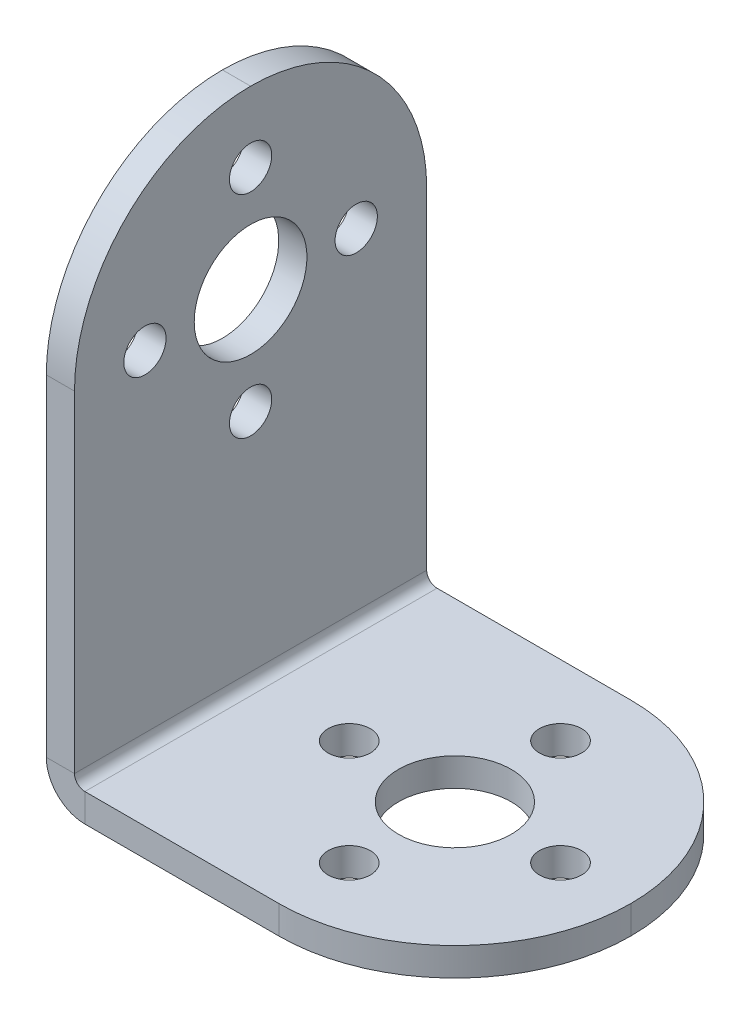
ISO-10303-21;
HEADER;
FILE_DESCRIPTION(('STEP AP214'),'2;1');
FILE_NAME('part.step','',(''),(''),'','','');
FILE_SCHEMA(('AUTOMOTIVE_DESIGN { 1 0 10303 214 1 1 1 1 }'));
ENDSEC;
DATA;
#1=APPLICATION_CONTEXT('core data for automotive mechanical design processes');
#2=APPLICATION_PROTOCOL_DEFINITION('international standard','automotive_design',2000,#1);
#3=PRODUCT_CONTEXT('',#1,'mechanical');
#4=PRODUCT('Part','Part','',(#3));
#5=PRODUCT_RELATED_PRODUCT_CATEGORY('part','',(#4));
#6=PRODUCT_DEFINITION_FORMATION('','',#4);
#7=PRODUCT_DEFINITION_CONTEXT('part definition',#1,'design');
#8=PRODUCT_DEFINITION('design','',#6,#7);
#9=PRODUCT_DEFINITION_SHAPE('','',#8);
#10=(LENGTH_UNIT() NAMED_UNIT(*) SI_UNIT(.MILLI.,.METRE.));
#11=(NAMED_UNIT(*) PLANE_ANGLE_UNIT() SI_UNIT($,.RADIAN.));
#12=(NAMED_UNIT(*) SI_UNIT($,.STERADIAN.) SOLID_ANGLE_UNIT());
#13=UNCERTAINTY_MEASURE_WITH_UNIT(LENGTH_MEASURE(1.E-05),#10,'distance_accuracy_value','');
#14=(GEOMETRIC_REPRESENTATION_CONTEXT(3) GLOBAL_UNCERTAINTY_ASSIGNED_CONTEXT((#13)) GLOBAL_UNIT_ASSIGNED_CONTEXT((#10,
#11,#12)) REPRESENTATION_CONTEXT('',''));
#15=CARTESIAN_POINT('',(0.,0.,0.));
#16=DIRECTION('',(0.,0.,1.));
#17=DIRECTION('',(1.,0.,0.));
#18=AXIS2_PLACEMENT_3D('',#15,#16,#17);
#19=CARTESIAN_POINT('',(3.50000000000008,24.246355098888,12.5));
#20=DIRECTION('',(0.,0.,1.));
#21=DIRECTION('',(0.,-1.,0.));
#22=AXIS2_PLACEMENT_3D('',#19,#20,#21);
#23=PLANE('',#22);
#24=DIRECTION('',(0.,-1.,0.));
#25=VECTOR('',#24,1.);
#26=CARTESIAN_POINT('',(3.50000000000008,24.246355098888,12.5));
#27=LINE('',#26,#25);
#28=CARTESIAN_POINT('',(3.50000000000008,24.246355098888,12.5));
#29=VERTEX_POINT('',#28);
#30=CARTESIAN_POINT('',(3.5,0.736600000000013,12.5));
#31=VERTEX_POINT('',#30);
#32=EDGE_CURVE('E288',#29,#31,#27,.T.);
#33=ORIENTED_EDGE('',*,*,#32,.T.);
#34=DIRECTION('',(1.,0.,0.));
#35=VECTOR('',#34,1.);
#36=CARTESIAN_POINT('',(3.5,0.736600000000013,12.5));
#37=LINE('',#36,#35);
#38=CARTESIAN_POINT('',(5.5,0.736600000000006,12.5));
#39=VERTEX_POINT('',#38);
#40=EDGE_CURVE('E12',#31,#39,#37,.T.);
#41=ORIENTED_EDGE('',*,*,#40,.T.);
#42=DIRECTION('',(0.,-1.,0.));
#43=VECTOR('',#42,1.);
#44=CARTESIAN_POINT('',(5.50000000000008,24.246355098888,12.5));
#45=LINE('',#44,#43);
#46=CARTESIAN_POINT('',(5.50000000000008,24.246355098888,12.5));
#47=VERTEX_POINT('',#46);
#48=EDGE_CURVE('E62',#47,#39,#45,.T.);
#49=ORIENTED_EDGE('',*,*,#48,.F.);
#50=DIRECTION('',(1.,0.,0.));
#51=VECTOR('',#50,1.);
#52=CARTESIAN_POINT('',(3.50000000000008,24.246355098888,12.5));
#53=LINE('',#52,#51);
#54=EDGE_CURVE('E162',#29,#47,#53,.T.);
#55=ORIENTED_EDGE('',*,*,#54,.F.);
#56=EDGE_LOOP('',(#33,#41,#49,#55));
#57=FACE_BOUND('',#56,.T.);
#58=ADVANCED_FACE('F46',(#57),#23,.T.);
#59=CARTESIAN_POINT('',(3.50000000000008,24.246355098888,-12.5));
#60=DIRECTION('',(0.,0.,-1.));
#61=DIRECTION('',(0.,1.,0.));
#62=AXIS2_PLACEMENT_3D('',#59,#60,#61);
#63=PLANE('',#62);
#64=DIRECTION('',(0.,1.,0.));
#65=VECTOR('',#64,1.);
#66=CARTESIAN_POINT('',(5.50000000000008,24.246355098888,-12.5));
#67=LINE('',#66,#65);
#68=CARTESIAN_POINT('',(5.49999999999999,0.736600000000006,-12.5));
#69=VERTEX_POINT('',#68);
#70=CARTESIAN_POINT('',(5.50000000000008,24.246355098888,-12.5));
#71=VERTEX_POINT('',#70);
#72=EDGE_CURVE('E69',#69,#71,#67,.T.);
#73=ORIENTED_EDGE('',*,*,#72,.F.);
#74=DIRECTION('',(-1.,0.,0.));
#75=VECTOR('',#74,1.);
#76=CARTESIAN_POINT('',(3.49999999999999,0.736600000000013,-12.5));
#77=LINE('',#76,#75);
#78=CARTESIAN_POINT('',(3.49999999999999,0.736600000000007,-12.5));
#79=VERTEX_POINT('',#78);
#80=EDGE_CURVE('E134',#69,#79,#77,.T.);
#81=ORIENTED_EDGE('',*,*,#80,.T.);
#82=DIRECTION('',(0.,1.,0.));
#83=VECTOR('',#82,1.);
#84=CARTESIAN_POINT('',(3.50000000000008,24.246355098888,-12.5));
#85=LINE('',#84,#83);
#86=CARTESIAN_POINT('',(3.50000000000008,24.246355098888,-12.5));
#87=VERTEX_POINT('',#86);
#88=EDGE_CURVE('E49',#79,#87,#85,.T.);
#89=ORIENTED_EDGE('',*,*,#88,.T.);
#90=DIRECTION('',(1.,0.,0.));
#91=VECTOR('',#90,1.);
#92=CARTESIAN_POINT('',(3.50000000000008,24.246355098888,-12.5));
#93=LINE('',#92,#91);
#94=EDGE_CURVE('E302',#87,#71,#93,.T.);
#95=ORIENTED_EDGE('',*,*,#94,.T.);
#96=EDGE_LOOP('',(#73,#81,#89,#95));
#97=FACE_BOUND('',#96,.T.);
#98=ADVANCED_FACE('F136',(#97),#63,.T.);
#99=CARTESIAN_POINT('',(5.49999999999994,-15.755644901112,0.00100000000000378));
#100=DIRECTION('',(1.,0.,0.));
#101=DIRECTION('',(0.,0.,1.));
#102=AXIS2_PLACEMENT_3D('',#99,#100,#101);
#103=PLANE('',#102);
#104=CARTESIAN_POINT('',(5.50000000000008,24.246355098888,0.000999999999998224));
#105=DIRECTION('',(1.,0.,0.));
#106=DIRECTION('',(0.,0.,1.));
#107=AXIS2_PLACEMENT_3D('',#104,#105,#106);
#108=CIRCLE('',#107,4.);
#109=CARTESIAN_POINT('',(5.50000000000008,24.246355098888,4.001));
#110=VERTEX_POINT('',#109);
#111=EDGE_CURVE('E273',#110,#110,#108,.T.);
#112=ORIENTED_EDGE('',*,*,#111,.F.);
#113=EDGE_LOOP('',(#112));
#114=FACE_BOUND('',#113,.T.);
#115=CARTESIAN_POINT('',(5.50000000000008,24.246355098836,-7.499));
#116=DIRECTION('',(1.,0.,0.));
#117=DIRECTION('',(0.,0.,1.));
#118=AXIS2_PLACEMENT_3D('',#115,#116,#117);
#119=CIRCLE('',#118,1.5);
#120=CARTESIAN_POINT('',(5.50000000000008,24.246355098836,-5.999));
#121=VERTEX_POINT('',#120);
#122=EDGE_CURVE('E267',#121,#121,#119,.T.);
#123=ORIENTED_EDGE('',*,*,#122,.F.);
#124=EDGE_LOOP('',(#123));
#125=FACE_BOUND('',#124,.T.);
#126=CARTESIAN_POINT('',(5.50000000000005,16.7463551655546,0.));
#127=DIRECTION('',(1.,0.,0.));
#128=DIRECTION('',(0.,0.,1.));
#129=AXIS2_PLACEMENT_3D('',#126,#127,#128);
#130=CIRCLE('',#129,1.5);
#131=CARTESIAN_POINT('',(5.50000000000005,16.7463551655546,1.5));
#132=VERTEX_POINT('',#131);
#133=EDGE_CURVE('E261',#132,#132,#130,.T.);
#134=ORIENTED_EDGE('',*,*,#133,.F.);
#135=EDGE_LOOP('',(#134));
#136=FACE_BOUND('',#135,.T.);
#137=CARTESIAN_POINT('',(5.50000000000008,24.246355098888,7.501));
#138=DIRECTION('',(1.,0.,0.));
#139=DIRECTION('',(0.,0.,1.));
#140=AXIS2_PLACEMENT_3D('',#137,#138,#139);
#141=CIRCLE('',#140,1.5);
#142=CARTESIAN_POINT('',(5.50000000000008,24.246355098888,9.001));
#143=VERTEX_POINT('',#142);
#144=EDGE_CURVE('E255',#143,#143,#141,.T.);
#145=ORIENTED_EDGE('',*,*,#144,.F.);
#146=EDGE_LOOP('',(#145));
#147=FACE_BOUND('',#146,.T.);
#148=CARTESIAN_POINT('',(5.5000000000001,31.7463550613889,0.00025000937890369));
#149=DIRECTION('',(1.,0.,0.));
#150=DIRECTION('',(0.,0.,1.));
#151=AXIS2_PLACEMENT_3D('',#148,#149,#150);
#152=CIRCLE('',#151,1.5);
#153=CARTESIAN_POINT('',(5.5000000000001,31.7463550613889,1.5002500093789));
#154=VERTEX_POINT('',#153);
#155=EDGE_CURVE('E183',#154,#154,#152,.T.);
#156=ORIENTED_EDGE('',*,*,#155,.F.);
#157=EDGE_LOOP('',(#156));
#158=FACE_BOUND('',#157,.T.);
#159=ORIENTED_EDGE('',*,*,#48,.T.);
#160=DIRECTION('',(0.,0.,-1.));
#161=VECTOR('',#160,1.);
#162=CARTESIAN_POINT('',(5.5,0.736600000000004,0.00100000000000378));
#163=LINE('',#162,#161);
#164=EDGE_CURVE('E54',#39,#69,#163,.T.);
#165=ORIENTED_EDGE('',*,*,#164,.T.);
#166=ORIENTED_EDGE('',*,*,#72,.T.);
#167=CARTESIAN_POINT('',(5.50000000000008,24.246355098888,-0.00100000000000378));
#168=DIRECTION('',(1.,0.,0.));
#169=DIRECTION('',(0.,0.,-1.));
#170=AXIS2_PLACEMENT_3D('',#167,#168,#169);
#171=CIRCLE('',#170,12.499);
#172=CARTESIAN_POINT('',(5.50000000000012,36.745355098888,-0.00100000000000551));
#173=VERTEX_POINT('',#172);
#174=EDGE_CURVE('E289',#71,#173,#171,.T.);
#175=ORIENTED_EDGE('',*,*,#174,.T.);
#176=DIRECTION('',(0.,0.,1.));
#177=VECTOR('',#176,1.);
#178=CARTESIAN_POINT('',(5.50000000000012,36.745355098888,0.00099999999999649));
#179=LINE('',#178,#177);
#180=CARTESIAN_POINT('',(5.50000000000012,36.745355098888,0.000999999999998786));
#181=VERTEX_POINT('',#180);
#182=EDGE_CURVE('E292',#173,#181,#179,.T.);
#183=ORIENTED_EDGE('',*,*,#182,.T.);
#184=CARTESIAN_POINT('',(5.50000000000008,24.246355098888,0.000999999999998224));
#185=DIRECTION('',(1.,0.,0.));
#186=DIRECTION('',(0.,0.,-1.));
#187=AXIS2_PLACEMENT_3D('',#184,#185,#186);
#188=CIRCLE('',#187,12.499);
#189=EDGE_CURVE('E295',#181,#47,#188,.T.);
#190=ORIENTED_EDGE('',*,*,#189,.T.);
#191=EDGE_LOOP('',(#159,#165,#166,#175,#183,#190));
#192=FACE_BOUND('',#191,.T.);
#193=ADVANCED_FACE('F306',(#114,#125,#136,#147,#158,#192),#103,.T.);
#194=CARTESIAN_POINT('',(3.50000000000008,24.246355098888,0.000999999999998502));
#195=DIRECTION('',(1.,0.,0.));
#196=DIRECTION('',(0.,0.,1.));
#197=AXIS2_PLACEMENT_3D('',#194,#195,#196);
#198=CYLINDRICAL_SURFACE('',#197,12.499);
#199=ORIENTED_EDGE('',*,*,#189,.F.);
#200=DIRECTION('',(1.,0.,0.));
#201=VECTOR('',#200,1.);
#202=CARTESIAN_POINT('',(3.50000000000012,36.745355098888,0.000999999999999063));
#203=LINE('',#202,#201);
#204=CARTESIAN_POINT('',(3.50000000000012,36.745355098888,0.000999999999999063));
#205=VERTEX_POINT('',#204);
#206=EDGE_CURVE('E298',#205,#181,#203,.T.);
#207=ORIENTED_EDGE('',*,*,#206,.F.);
#208=CARTESIAN_POINT('',(3.50000000000008,24.246355098888,0.000999999999998502));
#209=DIRECTION('',(1.,0.,0.));
#210=DIRECTION('',(0.,0.,-1.));
#211=AXIS2_PLACEMENT_3D('',#208,#209,#210);
#212=CIRCLE('',#211,12.499);
#213=EDGE_CURVE('E285',#205,#29,#212,.T.);
#214=ORIENTED_EDGE('',*,*,#213,.T.);
#215=ORIENTED_EDGE('',*,*,#54,.T.);
#216=EDGE_LOOP('',(#199,#207,#214,#215));
#217=FACE_BOUND('',#216,.T.);
#218=ADVANCED_FACE('F368',(#217),#198,.T.);
#219=CARTESIAN_POINT('',(3.50000000000012,36.745355098888,0.000999999999996767));
#220=DIRECTION('',(0.,1.,0.));
#221=DIRECTION('',(0.,0.,1.));
#222=AXIS2_PLACEMENT_3D('',#219,#220,#221);
#223=PLANE('',#222);
#224=ORIENTED_EDGE('',*,*,#182,.F.);
#225=DIRECTION('',(1.,0.,0.));
#226=VECTOR('',#225,1.);
#227=CARTESIAN_POINT('',(3.50000000000012,36.745355098888,-0.00100000000000523));
#228=LINE('',#227,#226);
#229=CARTESIAN_POINT('',(3.50000000000012,36.745355098888,-0.00100000000000523));
#230=VERTEX_POINT('',#229);
#231=EDGE_CURVE('E300',#230,#173,#228,.T.);
#232=ORIENTED_EDGE('',*,*,#231,.F.);
#233=DIRECTION('',(0.,0.,1.));
#234=VECTOR('',#233,1.);
#235=CARTESIAN_POINT('',(3.50000000000012,36.745355098888,0.000999999999996767));
#236=LINE('',#235,#234);
#237=EDGE_CURVE('E282',#230,#205,#236,.T.);
#238=ORIENTED_EDGE('',*,*,#237,.T.);
#239=ORIENTED_EDGE('',*,*,#206,.T.);
#240=EDGE_LOOP('',(#224,#232,#238,#239));
#241=FACE_BOUND('',#240,.T.);
#242=ADVANCED_FACE('F313',(#241),#223,.T.);
#243=CARTESIAN_POINT('',(3.50000000000008,24.246355098888,-0.0010000000000035));
#244=DIRECTION('',(1.,0.,0.));
#245=DIRECTION('',(0.,0.,1.));
#246=AXIS2_PLACEMENT_3D('',#243,#244,#245);
#247=CYLINDRICAL_SURFACE('',#246,12.499);
#248=ORIENTED_EDGE('',*,*,#174,.F.);
#249=ORIENTED_EDGE('',*,*,#94,.F.);
#250=CARTESIAN_POINT('',(3.50000000000008,24.246355098888,-0.0010000000000035));
#251=DIRECTION('',(1.,0.,0.));
#252=DIRECTION('',(0.,0.,-1.));
#253=AXIS2_PLACEMENT_3D('',#250,#251,#252);
#254=CIRCLE('',#253,12.499);
#255=EDGE_CURVE('E153',#87,#230,#254,.T.);
#256=ORIENTED_EDGE('',*,*,#255,.T.);
#257=ORIENTED_EDGE('',*,*,#231,.T.);
#258=EDGE_LOOP('',(#248,#249,#256,#257));
#259=FACE_BOUND('',#258,.T.);
#260=ADVANCED_FACE('F310',(#259),#247,.T.);
#261=CARTESIAN_POINT('',(3.49999999999994,-15.755644901112,0.00100000000000405));
#262=DIRECTION('',(1.,0.,0.));
#263=DIRECTION('',(0.,0.,1.));
#264=AXIS2_PLACEMENT_3D('',#261,#262,#263);
#265=PLANE('',#264);
#266=DIRECTION('',(0.,0.,-1.));
#267=VECTOR('',#266,1.);
#268=CARTESIAN_POINT('',(3.5,0.736600000000011,0.00100000000000405));
#269=LINE('',#268,#267);
#270=EDGE_CURVE('E142',#31,#79,#269,.T.);
#271=ORIENTED_EDGE('',*,*,#270,.F.);
#272=ORIENTED_EDGE('',*,*,#32,.F.);
#273=ORIENTED_EDGE('',*,*,#213,.F.);
#274=ORIENTED_EDGE('',*,*,#237,.F.);
#275=ORIENTED_EDGE('',*,*,#255,.F.);
#276=ORIENTED_EDGE('',*,*,#88,.F.);
#277=EDGE_LOOP('',(#271,#272,#273,#274,#275,#276));
#278=FACE_BOUND('',#277,.T.);
#279=CARTESIAN_POINT('',(3.5000000000001,31.7463550613889,0.000250009378903968));
#280=DIRECTION('',(1.,0.,0.));
#281=DIRECTION('',(0.,0.,1.));
#282=AXIS2_PLACEMENT_3D('',#279,#280,#281);
#283=CIRCLE('',#282,1.5);
#284=CARTESIAN_POINT('',(3.5000000000001,31.7463550613889,1.5002500093789));
#285=VERTEX_POINT('',#284);
#286=EDGE_CURVE('E252',#285,#285,#283,.T.);
#287=ORIENTED_EDGE('',*,*,#286,.T.);
#288=EDGE_LOOP('',(#287));
#289=FACE_BOUND('',#288,.T.);
#290=CARTESIAN_POINT('',(3.50000000000008,24.246355098888,7.501));
#291=DIRECTION('',(1.,0.,0.));
#292=DIRECTION('',(0.,0.,1.));
#293=AXIS2_PLACEMENT_3D('',#290,#291,#292);
#294=CIRCLE('',#293,1.5);
#295=CARTESIAN_POINT('',(3.50000000000008,24.246355098888,9.001));
#296=VERTEX_POINT('',#295);
#297=EDGE_CURVE('E258',#296,#296,#294,.T.);
#298=ORIENTED_EDGE('',*,*,#297,.T.);
#299=EDGE_LOOP('',(#298));
#300=FACE_BOUND('',#299,.T.);
#301=CARTESIAN_POINT('',(3.50000000000005,16.7463551655547,0.));
#302=DIRECTION('',(1.,0.,0.));
#303=DIRECTION('',(0.,0.,1.));
#304=AXIS2_PLACEMENT_3D('',#301,#302,#303);
#305=CIRCLE('',#304,1.5);
#306=CARTESIAN_POINT('',(3.50000000000005,16.7463551655547,1.5));
#307=VERTEX_POINT('',#306);
#308=EDGE_CURVE('E264',#307,#307,#305,.T.);
#309=ORIENTED_EDGE('',*,*,#308,.T.);
#310=EDGE_LOOP('',(#309));
#311=FACE_BOUND('',#310,.T.);
#312=CARTESIAN_POINT('',(3.50000000000008,24.246355098836,-7.499));
#313=DIRECTION('',(1.,0.,0.));
#314=DIRECTION('',(0.,0.,1.));
#315=AXIS2_PLACEMENT_3D('',#312,#313,#314);
#316=CIRCLE('',#315,1.5);
#317=CARTESIAN_POINT('',(3.50000000000008,24.246355098836,-5.999));
#318=VERTEX_POINT('',#317);
#319=EDGE_CURVE('E270',#318,#318,#316,.T.);
#320=ORIENTED_EDGE('',*,*,#319,.T.);
#321=EDGE_LOOP('',(#320));
#322=FACE_BOUND('',#321,.T.);
#323=CARTESIAN_POINT('',(3.50000000000008,24.246355098888,0.000999999999998502));
#324=DIRECTION('',(1.,0.,0.));
#325=DIRECTION('',(0.,0.,1.));
#326=AXIS2_PLACEMENT_3D('',#323,#324,#325);
#327=CIRCLE('',#326,4.);
#328=CARTESIAN_POINT('',(3.50000000000008,24.246355098888,4.001));
#329=VERTEX_POINT('',#328);
#330=EDGE_CURVE('E276',#329,#329,#327,.T.);
#331=ORIENTED_EDGE('',*,*,#330,.T.);
#332=EDGE_LOOP('',(#331));
#333=FACE_BOUND('',#332,.T.);
#334=ADVANCED_FACE('F147',(#278,#289,#300,#311,#322,#333),#265,.F.);
#335=CARTESIAN_POINT('',(3.50000000000008,24.246355098888,0.000999999999998502));
#336=DIRECTION('',(1.,0.,0.));
#337=DIRECTION('',(0.,0.,1.));
#338=AXIS2_PLACEMENT_3D('',#335,#336,#337);
#339=CYLINDRICAL_SURFACE('',#338,4.);
#340=ORIENTED_EDGE('',*,*,#330,.F.);
#341=EDGE_LOOP('',(#340));
#342=FACE_BOUND('',#341,.T.);
#343=ORIENTED_EDGE('',*,*,#111,.T.);
#344=EDGE_LOOP('',(#343));
#345=FACE_BOUND('',#344,.T.);
#346=ADVANCED_FACE('F373',(#342,#345),#339,.F.);
#347=CARTESIAN_POINT('',(3.50000000000008,24.246355098836,-7.499));
#348=DIRECTION('',(1.,0.,0.));
#349=DIRECTION('',(0.,0.,1.));
#350=AXIS2_PLACEMENT_3D('',#347,#348,#349);
#351=CYLINDRICAL_SURFACE('',#350,1.5);
#352=ORIENTED_EDGE('',*,*,#319,.F.);
#353=EDGE_LOOP('',(#352));
#354=FACE_BOUND('',#353,.T.);
#355=ORIENTED_EDGE('',*,*,#122,.T.);
#356=EDGE_LOOP('',(#355));
#357=FACE_BOUND('',#356,.T.);
#358=ADVANCED_FACE('F382',(#354,#357),#351,.F.);
#359=CARTESIAN_POINT('',(3.50000000000005,16.7463551655547,0.));
#360=DIRECTION('',(1.,0.,0.));
#361=DIRECTION('',(0.,0.,1.));
#362=AXIS2_PLACEMENT_3D('',#359,#360,#361);
#363=CYLINDRICAL_SURFACE('',#362,1.5);
#364=ORIENTED_EDGE('',*,*,#308,.F.);
#365=EDGE_LOOP('',(#364));
#366=FACE_BOUND('',#365,.T.);
#367=ORIENTED_EDGE('',*,*,#133,.T.);
#368=EDGE_LOOP('',(#367));
#369=FACE_BOUND('',#368,.T.);
#370=ADVANCED_FACE('F386',(#366,#369),#363,.F.);
#371=CARTESIAN_POINT('',(3.50000000000008,24.246355098888,7.501));
#372=DIRECTION('',(1.,0.,0.));
#373=DIRECTION('',(0.,0.,1.));
#374=AXIS2_PLACEMENT_3D('',#371,#372,#373);
#375=CYLINDRICAL_SURFACE('',#374,1.5);
#376=ORIENTED_EDGE('',*,*,#297,.F.);
#377=EDGE_LOOP('',(#376));
#378=FACE_BOUND('',#377,.T.);
#379=ORIENTED_EDGE('',*,*,#144,.T.);
#380=EDGE_LOOP('',(#379));
#381=FACE_BOUND('',#380,.T.);
#382=ADVANCED_FACE('F390',(#378,#381),#375,.F.);
#383=CARTESIAN_POINT('',(3.5000000000001,31.7463550613889,0.000250009378903968));
#384=DIRECTION('',(1.,0.,0.));
#385=DIRECTION('',(0.,0.,1.));
#386=AXIS2_PLACEMENT_3D('',#383,#384,#385);
#387=CYLINDRICAL_SURFACE('',#386,1.5);
#388=ORIENTED_EDGE('',*,*,#286,.F.);
#389=EDGE_LOOP('',(#388));
#390=FACE_BOUND('',#389,.T.);
#391=ORIENTED_EDGE('',*,*,#155,.T.);
#392=EDGE_LOOP('',(#391));
#393=FACE_BOUND('',#392,.T.);
#394=ADVANCED_FACE('F394',(#390,#393),#387,.F.);
#395=CARTESIAN_POINT('',(20.001,-2.,0.001000000000001));
#396=DIRECTION('',(0.,1.,0.));
#397=DIRECTION('',(0.,0.,1.));
#398=AXIS2_PLACEMENT_3D('',#395,#396,#397);
#399=CYLINDRICAL_SURFACE('',#398,12.499);
#400=CARTESIAN_POINT('',(20.001,0.,0.001000000000001));
#401=DIRECTION('',(0.,1.,0.));
#402=DIRECTION('',(0.,0.,1.));
#403=AXIS2_PLACEMENT_3D('',#400,#401,#402);
#404=CIRCLE('',#403,12.499);
#405=CARTESIAN_POINT('',(20.001,0.,12.5));
#406=VERTEX_POINT('',#405);
#407=CARTESIAN_POINT('',(32.5,0.,0.001000000000001));
#408=VERTEX_POINT('',#407);
#409=EDGE_CURVE('E194',#406,#408,#404,.T.);
#410=ORIENTED_EDGE('',*,*,#409,.F.);
#411=DIRECTION('',(0.,1.,0.));
#412=VECTOR('',#411,1.);
#413=CARTESIAN_POINT('',(20.001,-2.,12.5));
#414=LINE('',#413,#412);
#415=CARTESIAN_POINT('',(20.001,-2.,12.5));
#416=VERTEX_POINT('',#415);
#417=EDGE_CURVE('E180',#416,#406,#414,.T.);
#418=ORIENTED_EDGE('',*,*,#417,.F.);
#419=CARTESIAN_POINT('',(20.001,-2.,0.001000000000001));
#420=DIRECTION('',(0.,1.,0.));
#421=DIRECTION('',(0.,0.,1.));
#422=AXIS2_PLACEMENT_3D('',#419,#420,#421);
#423=CIRCLE('',#422,12.499);
#424=CARTESIAN_POINT('',(32.5,-2.,0.001000000000001));
#425=VERTEX_POINT('',#424);
#426=EDGE_CURVE('E246',#416,#425,#423,.T.);
#427=ORIENTED_EDGE('',*,*,#426,.T.);
#428=DIRECTION('',(0.,1.,0.));
#429=VECTOR('',#428,1.);
#430=CARTESIAN_POINT('',(32.5,-2.,0.001000000000001));
#431=LINE('',#430,#429);
#432=EDGE_CURVE('E244',#425,#408,#431,.T.);
#433=ORIENTED_EDGE('',*,*,#432,.T.);
#434=EDGE_LOOP('',(#410,#418,#427,#433));
#435=FACE_BOUND('',#434,.T.);
#436=ADVANCED_FACE('F343',(#435),#399,.T.);
#437=CARTESIAN_POINT('',(32.5,-2.,0.001000000000001));
#438=DIRECTION('',(1.,0.,0.));
#439=DIRECTION('',(0.,0.,-1.));
#440=AXIS2_PLACEMENT_3D('',#437,#438,#439);
#441=PLANE('',#440);
#442=DIRECTION('',(0.,0.,-1.));
#443=VECTOR('',#442,1.);
#444=CARTESIAN_POINT('',(32.5,0.,0.001000000000001));
#445=LINE('',#444,#443);
#446=CARTESIAN_POINT('',(32.5,0.,-0.00100000000000177));
#447=VERTEX_POINT('',#446);
#448=EDGE_CURVE('E191',#408,#447,#445,.T.);
#449=ORIENTED_EDGE('',*,*,#448,.F.);
#450=ORIENTED_EDGE('',*,*,#432,.F.);
#451=DIRECTION('',(0.,0.,-1.));
#452=VECTOR('',#451,1.);
#453=CARTESIAN_POINT('',(32.5,-2.,0.001000000000001));
#454=LINE('',#453,#452);
#455=CARTESIAN_POINT('',(32.5,-2.,-0.00100000000000177));
#456=VERTEX_POINT('',#455);
#457=EDGE_CURVE('E241',#425,#456,#454,.T.);
#458=ORIENTED_EDGE('',*,*,#457,.T.);
#459=DIRECTION('',(0.,1.,0.));
#460=VECTOR('',#459,1.);
#461=CARTESIAN_POINT('',(32.5,-2.,-0.00100000000000177));
#462=LINE('',#461,#460);
#463=EDGE_CURVE('E239',#456,#447,#462,.T.);
#464=ORIENTED_EDGE('',*,*,#463,.T.);
#465=EDGE_LOOP('',(#449,#450,#458,#464));
#466=FACE_BOUND('',#465,.T.);
#467=ADVANCED_FACE('F346',(#466),#441,.T.);
#468=CARTESIAN_POINT('',(20.001,-2.,-0.001000000000001));
#469=DIRECTION('',(0.,1.,0.));
#470=DIRECTION('',(0.,0.,1.));
#471=AXIS2_PLACEMENT_3D('',#468,#469,#470);
#472=CYLINDRICAL_SURFACE('',#471,12.499);
#473=CARTESIAN_POINT('',(20.001,0.,-0.001000000000001));
#474=DIRECTION('',(0.,1.,0.));
#475=DIRECTION('',(0.,0.,-1.));
#476=AXIS2_PLACEMENT_3D('',#473,#474,#475);
#477=CIRCLE('',#476,12.499);
#478=CARTESIAN_POINT('',(20.001,0.,-12.5));
#479=VERTEX_POINT('',#478);
#480=EDGE_CURVE('E188',#447,#479,#477,.T.);
#481=ORIENTED_EDGE('',*,*,#480,.F.);
#482=ORIENTED_EDGE('',*,*,#463,.F.);
#483=CARTESIAN_POINT('',(20.001,-2.,-0.001000000000001));
#484=DIRECTION('',(0.,1.,0.));
#485=DIRECTION('',(0.,0.,-1.));
#486=AXIS2_PLACEMENT_3D('',#483,#484,#485);
#487=CIRCLE('',#486,12.499);
#488=CARTESIAN_POINT('',(20.001,-2.,-12.5));
#489=VERTEX_POINT('',#488);
#490=EDGE_CURVE('E236',#456,#489,#487,.T.);
#491=ORIENTED_EDGE('',*,*,#490,.T.);
#492=DIRECTION('',(0.,1.,0.));
#493=VECTOR('',#492,1.);
#494=CARTESIAN_POINT('',(20.001,-2.,-12.5));
#495=LINE('',#494,#493);
#496=EDGE_CURVE('E234',#489,#479,#495,.T.);
#497=ORIENTED_EDGE('',*,*,#496,.T.);
#498=EDGE_LOOP('',(#481,#482,#491,#497));
#499=FACE_BOUND('',#498,.T.);
#500=ADVANCED_FACE('F348',(#499),#472,.T.);
#501=CARTESIAN_POINT('',(12.501,-2.,-0.000250009374882337));
#502=DIRECTION('',(0.,1.,0.));
#503=DIRECTION('',(0.,0.,1.));
#504=AXIS2_PLACEMENT_3D('',#501,#502,#503);
#505=CYLINDRICAL_SURFACE('',#504,1.50000000000001);
#506=CARTESIAN_POINT('',(12.501,-2.,-0.000250009374882337));
#507=DIRECTION('',(0.,1.,0.));
#508=DIRECTION('',(0.,0.,1.));
#509=AXIS2_PLACEMENT_3D('',#506,#507,#508);
#510=CIRCLE('',#509,1.50000000000001);
#511=CARTESIAN_POINT('',(12.501,-2.,1.49974999062513));
#512=VERTEX_POINT('',#511);
#513=EDGE_CURVE('E204',#512,#512,#510,.T.);
#514=ORIENTED_EDGE('',*,*,#513,.F.);
#515=EDGE_LOOP('',(#514));
#516=FACE_BOUND('',#515,.T.);
#517=CARTESIAN_POINT('',(12.501,0.,-0.000250009374882337));
#518=DIRECTION('',(0.,1.,0.));
#519=DIRECTION('',(0.,0.,1.));
#520=AXIS2_PLACEMENT_3D('',#517,#518,#519);
#521=CIRCLE('',#520,1.50000000000001);
#522=CARTESIAN_POINT('',(12.501,0.,1.49974999062513));
#523=VERTEX_POINT('',#522);
#524=EDGE_CURVE('E231',#523,#523,#521,.T.);
#525=ORIENTED_EDGE('',*,*,#524,.T.);
#526=EDGE_LOOP('',(#525));
#527=FACE_BOUND('',#526,.T.);
#528=ADVANCED_FACE('F350',(#516,#527),#505,.F.);
#529=CARTESIAN_POINT('',(20.001,-2.,7.49974999062512));
#530=DIRECTION('',(0.,1.,0.));
#531=DIRECTION('',(0.,0.,1.));
#532=AXIS2_PLACEMENT_3D('',#529,#530,#531);
#533=CYLINDRICAL_SURFACE('',#532,1.5);
#534=CARTESIAN_POINT('',(20.001,-2.,7.49974999062512));
#535=DIRECTION('',(0.,1.,0.));
#536=DIRECTION('',(0.,0.,1.));
#537=AXIS2_PLACEMENT_3D('',#534,#535,#536);
#538=CIRCLE('',#537,1.5);
#539=CARTESIAN_POINT('',(20.001,-2.,8.99974999062512));
#540=VERTEX_POINT('',#539);
#541=EDGE_CURVE('E207',#540,#540,#538,.T.);
#542=ORIENTED_EDGE('',*,*,#541,.F.);
#543=EDGE_LOOP('',(#542));
#544=FACE_BOUND('',#543,.T.);
#545=CARTESIAN_POINT('',(20.001,0.,7.49974999062512));
#546=DIRECTION('',(0.,1.,0.));
#547=DIRECTION('',(0.,0.,1.));
#548=AXIS2_PLACEMENT_3D('',#545,#546,#547);
#549=CIRCLE('',#548,1.5);
#550=CARTESIAN_POINT('',(20.001,0.,8.99974999062512));
#551=VERTEX_POINT('',#550);
#552=EDGE_CURVE('E228',#551,#551,#549,.T.);
#553=ORIENTED_EDGE('',*,*,#552,.T.);
#554=EDGE_LOOP('',(#553));
#555=FACE_BOUND('',#554,.T.);
#556=ADVANCED_FACE('F356',(#544,#555),#533,.F.);
#557=CARTESIAN_POINT('',(27.501,-2.,-0.000250009374884174));
#558=DIRECTION('',(0.,1.,0.));
#559=DIRECTION('',(0.,0.,1.));
#560=AXIS2_PLACEMENT_3D('',#557,#558,#559);
#561=CYLINDRICAL_SURFACE('',#560,1.49999999999999);
#562=CARTESIAN_POINT('',(27.501,-2.,-0.000250009374884174));
#563=DIRECTION('',(0.,1.,0.));
#564=DIRECTION('',(0.,0.,1.));
#565=AXIS2_PLACEMENT_3D('',#562,#563,#564);
#566=CIRCLE('',#565,1.49999999999999);
#567=CARTESIAN_POINT('',(27.501,-2.,1.49974999062511));
#568=VERTEX_POINT('',#567);
#569=EDGE_CURVE('E210',#568,#568,#566,.T.);
#570=ORIENTED_EDGE('',*,*,#569,.F.);
#571=EDGE_LOOP('',(#570));
#572=FACE_BOUND('',#571,.T.);
#573=CARTESIAN_POINT('',(27.501,0.,-0.000250009374884174));
#574=DIRECTION('',(0.,1.,0.));
#575=DIRECTION('',(0.,0.,1.));
#576=AXIS2_PLACEMENT_3D('',#573,#574,#575);
#577=CIRCLE('',#576,1.49999999999999);
#578=CARTESIAN_POINT('',(27.501,0.,1.49974999062511));
#579=VERTEX_POINT('',#578);
#580=EDGE_CURVE('E225',#579,#579,#577,.T.);
#581=ORIENTED_EDGE('',*,*,#580,.T.);
#582=EDGE_LOOP('',(#581));
#583=FACE_BOUND('',#582,.T.);
#584=ADVANCED_FACE('F415',(#572,#583),#561,.F.);
#585=CARTESIAN_POINT('',(20.001,-2.,-7.50025000937488));
#586=DIRECTION('',(0.,1.,0.));
#587=DIRECTION('',(0.,0.,1.));
#588=AXIS2_PLACEMENT_3D('',#585,#586,#587);
#589=CYLINDRICAL_SURFACE('',#588,1.49999999999996);
#590=CARTESIAN_POINT('',(20.001,-2.,-7.50025000937488));
#591=DIRECTION('',(0.,1.,0.));
#592=DIRECTION('',(0.,0.,1.));
#593=AXIS2_PLACEMENT_3D('',#590,#591,#592);
#594=CIRCLE('',#593,1.49999999999996);
#595=CARTESIAN_POINT('',(20.001,-2.,-6.00025000937492));
#596=VERTEX_POINT('',#595);
#597=EDGE_CURVE('E213',#596,#596,#594,.T.);
#598=ORIENTED_EDGE('',*,*,#597,.F.);
#599=EDGE_LOOP('',(#598));
#600=FACE_BOUND('',#599,.T.);
#601=CARTESIAN_POINT('',(20.001,0.,-7.50025000937488));
#602=DIRECTION('',(0.,1.,0.));
#603=DIRECTION('',(0.,0.,1.));
#604=AXIS2_PLACEMENT_3D('',#601,#602,#603);
#605=CIRCLE('',#604,1.49999999999996);
#606=CARTESIAN_POINT('',(20.001,0.,-6.00025000937492));
#607=VERTEX_POINT('',#606);
#608=EDGE_CURVE('E222',#607,#607,#605,.T.);
#609=ORIENTED_EDGE('',*,*,#608,.T.);
#610=EDGE_LOOP('',(#609));
#611=FACE_BOUND('',#610,.T.);
#612=ADVANCED_FACE('F411',(#600,#611),#589,.F.);
#613=CARTESIAN_POINT('',(20.001,-2.,-0.000250009374883715));
#614=DIRECTION('',(0.,1.,0.));
#615=DIRECTION('',(0.,0.,1.));
#616=AXIS2_PLACEMENT_3D('',#613,#614,#615);
#617=CYLINDRICAL_SURFACE('',#616,4.00000000000001);
#618=CARTESIAN_POINT('',(20.001,-2.,-0.000250009374883715));
#619=DIRECTION('',(0.,1.,0.));
#620=DIRECTION('',(0.,0.,1.));
#621=AXIS2_PLACEMENT_3D('',#618,#619,#620);
#622=CIRCLE('',#621,4.00000000000001);
#623=CARTESIAN_POINT('',(20.001,-2.,3.99974999062513));
#624=VERTEX_POINT('',#623);
#625=EDGE_CURVE('E216',#624,#624,#622,.T.);
#626=ORIENTED_EDGE('',*,*,#625,.F.);
#627=EDGE_LOOP('',(#626));
#628=FACE_BOUND('',#627,.T.);
#629=CARTESIAN_POINT('',(20.001,0.,-0.000250009374883715));
#630=DIRECTION('',(0.,1.,0.));
#631=DIRECTION('',(0.,0.,1.));
#632=AXIS2_PLACEMENT_3D('',#629,#630,#631);
#633=CIRCLE('',#632,4.00000000000001);
#634=CARTESIAN_POINT('',(20.001,0.,3.99974999062513));
#635=VERTEX_POINT('',#634);
#636=EDGE_CURVE('E219',#635,#635,#633,.T.);
#637=ORIENTED_EDGE('',*,*,#636,.T.);
#638=EDGE_LOOP('',(#637));
#639=FACE_BOUND('',#638,.T.);
#640=ADVANCED_FACE('F407',(#628,#639),#617,.F.);
#641=CARTESIAN_POINT('',(20.001,-2.,0.001000000000001));
#642=DIRECTION('',(0.,1.,0.));
#643=DIRECTION('',(0.,0.,1.));
#644=AXIS2_PLACEMENT_3D('',#641,#642,#643);
#645=PLANE('',#644);
#646=ORIENTED_EDGE('',*,*,#625,.T.);
#647=EDGE_LOOP('',(#646));
#648=FACE_BOUND('',#647,.T.);
#649=ORIENTED_EDGE('',*,*,#597,.T.);
#650=EDGE_LOOP('',(#649));
#651=FACE_BOUND('',#650,.T.);
#652=ORIENTED_EDGE('',*,*,#569,.T.);
#653=EDGE_LOOP('',(#652));
#654=FACE_BOUND('',#653,.T.);
#655=ORIENTED_EDGE('',*,*,#541,.T.);
#656=EDGE_LOOP('',(#655));
#657=FACE_BOUND('',#656,.T.);
#658=ORIENTED_EDGE('',*,*,#513,.T.);
#659=EDGE_LOOP('',(#658));
#660=FACE_BOUND('',#659,.T.);
#661=DIRECTION('',(1.,0.,0.));
#662=VECTOR('',#661,1.);
#663=CARTESIAN_POINT('',(-20.001,-2.,12.5));
#664=LINE('',#663,#662);
#665=CARTESIAN_POINT('',(6.23659999999999,-2.,12.5));
#666=VERTEX_POINT('',#665);
#667=EDGE_CURVE('E184',#666,#416,#664,.T.);
#668=ORIENTED_EDGE('',*,*,#667,.F.);
#669=DIRECTION('',(0.,0.,-1.));
#670=VECTOR('',#669,1.);
#671=CARTESIAN_POINT('',(6.23659999999999,-2.,0.00100000000000291));
#672=LINE('',#671,#670);
#673=CARTESIAN_POINT('',(6.23659999999999,-2.,-12.5));
#674=VERTEX_POINT('',#673);
#675=EDGE_CURVE('E201',#666,#674,#672,.T.);
#676=ORIENTED_EDGE('',*,*,#675,.T.);
#677=DIRECTION('',(-1.,0.,0.));
#678=VECTOR('',#677,1.);
#679=CARTESIAN_POINT('',(-20.001,-2.,-12.5));
#680=LINE('',#679,#678);
#681=EDGE_CURVE('E199',#489,#674,#680,.T.);
#682=ORIENTED_EDGE('',*,*,#681,.F.);
#683=ORIENTED_EDGE('',*,*,#490,.F.);
#684=ORIENTED_EDGE('',*,*,#457,.F.);
#685=ORIENTED_EDGE('',*,*,#426,.F.);
#686=EDGE_LOOP('',(#668,#676,#682,#683,#684,#685));
#687=FACE_BOUND('',#686,.T.);
#688=ADVANCED_FACE('F339',(#648,#651,#654,#657,#660,#687),#645,.F.);
#689=CARTESIAN_POINT('',(-20.001,-2.,-12.5));
#690=DIRECTION('',(0.,0.,-1.));
#691=DIRECTION('',(-1.,0.,0.));
#692=AXIS2_PLACEMENT_3D('',#689,#690,#691);
#693=PLANE('',#692);
#694=DIRECTION('',(0.,-1.,0.));
#695=VECTOR('',#694,1.);
#696=CARTESIAN_POINT('',(6.23659999999999,-2.,-12.5));
#697=LINE('',#696,#695);
#698=CARTESIAN_POINT('',(6.23659999999999,0.,-12.5));
#699=VERTEX_POINT('',#698);
#700=EDGE_CURVE('E167',#699,#674,#697,.T.);
#701=ORIENTED_EDGE('',*,*,#700,.F.);
#702=DIRECTION('',(-1.,0.,0.));
#703=VECTOR('',#702,1.);
#704=CARTESIAN_POINT('',(-20.001,0.,-12.5));
#705=LINE('',#704,#703);
#706=EDGE_CURVE('E186',#479,#699,#705,.T.);
#707=ORIENTED_EDGE('',*,*,#706,.F.);
#708=ORIENTED_EDGE('',*,*,#496,.F.);
#709=ORIENTED_EDGE('',*,*,#681,.T.);
#710=EDGE_LOOP('',(#701,#707,#708,#709));
#711=FACE_BOUND('',#710,.T.);
#712=ADVANCED_FACE('F335',(#711),#693,.T.);
#713=CARTESIAN_POINT('',(20.001,0.,0.001000000000001));
#714=DIRECTION('',(0.,1.,0.));
#715=DIRECTION('',(0.,0.,1.));
#716=AXIS2_PLACEMENT_3D('',#713,#714,#715);
#717=PLANE('',#716);
#718=DIRECTION('',(0.,0.,-1.));
#719=VECTOR('',#718,1.);
#720=CARTESIAN_POINT('',(6.23659999999999,0.,0.00100000000000291));
#721=LINE('',#720,#719);
#722=CARTESIAN_POINT('',(6.23659999999999,0.,12.5));
#723=VERTEX_POINT('',#722);
#724=EDGE_CURVE('E171',#723,#699,#721,.T.);
#725=ORIENTED_EDGE('',*,*,#724,.F.);
#726=DIRECTION('',(1.,0.,0.));
#727=VECTOR('',#726,1.);
#728=CARTESIAN_POINT('',(-20.001,0.,12.5));
#729=LINE('',#728,#727);
#730=EDGE_CURVE('E197',#723,#406,#729,.T.);
#731=ORIENTED_EDGE('',*,*,#730,.T.);
#732=ORIENTED_EDGE('',*,*,#409,.T.);
#733=ORIENTED_EDGE('',*,*,#448,.T.);
#734=ORIENTED_EDGE('',*,*,#480,.T.);
#735=ORIENTED_EDGE('',*,*,#706,.T.);
#736=EDGE_LOOP('',(#725,#731,#732,#733,#734,#735));
#737=FACE_BOUND('',#736,.T.);
#738=ORIENTED_EDGE('',*,*,#524,.F.);
#739=EDGE_LOOP('',(#738));
#740=FACE_BOUND('',#739,.T.);
#741=ORIENTED_EDGE('',*,*,#552,.F.);
#742=EDGE_LOOP('',(#741));
#743=FACE_BOUND('',#742,.T.);
#744=ORIENTED_EDGE('',*,*,#580,.F.);
#745=EDGE_LOOP('',(#744));
#746=FACE_BOUND('',#745,.T.);
#747=ORIENTED_EDGE('',*,*,#608,.F.);
#748=EDGE_LOOP('',(#747));
#749=FACE_BOUND('',#748,.T.);
#750=ORIENTED_EDGE('',*,*,#636,.F.);
#751=EDGE_LOOP('',(#750));
#752=FACE_BOUND('',#751,.T.);
#753=ADVANCED_FACE('F330',(#737,#740,#743,#746,#749,#752),#717,.T.);
#754=CARTESIAN_POINT('',(-20.001,-2.,12.5));
#755=DIRECTION('',(0.,0.,1.));
#756=DIRECTION('',(1.,0.,0.));
#757=AXIS2_PLACEMENT_3D('',#754,#755,#756);
#758=PLANE('',#757);
#759=DIRECTION('',(0.,1.,0.));
#760=VECTOR('',#759,1.);
#761=CARTESIAN_POINT('',(6.23659999999999,-2.,12.5));
#762=LINE('',#761,#760);
#763=EDGE_CURVE('E168',#666,#723,#762,.T.);
#764=ORIENTED_EDGE('',*,*,#763,.F.);
#765=ORIENTED_EDGE('',*,*,#667,.T.);
#766=ORIENTED_EDGE('',*,*,#417,.T.);
#767=ORIENTED_EDGE('',*,*,#730,.F.);
#768=EDGE_LOOP('',(#764,#765,#766,#767));
#769=FACE_BOUND('',#768,.T.);
#770=ADVANCED_FACE('F325',(#769),#758,.T.);
#771=CARTESIAN_POINT('',(6.23659999999999,0.7366,12.5));
#772=DIRECTION('',(0.,0.,1.));
#773=DIRECTION('',(1.,0.,0.));
#774=AXIS2_PLACEMENT_3D('',#771,#772,#773);
#775=PLANE('',#774);
#776=ORIENTED_EDGE('',*,*,#763,.T.);
#777=CARTESIAN_POINT('',(6.23659999999999,0.7366,12.5));
#778=DIRECTION('',(0.,0.,-1.));
#779=DIRECTION('',(-1.,0.,0.));
#780=AXIS2_PLACEMENT_3D('',#777,#778,#779);
#781=CIRCLE('',#780,0.7366);
#782=EDGE_CURVE('E177',#723,#39,#781,.T.);
#783=ORIENTED_EDGE('',*,*,#782,.T.);
#784=ORIENTED_EDGE('',*,*,#40,.F.);
#785=CARTESIAN_POINT('',(6.23659999999999,0.7366,12.5));
#786=DIRECTION('',(0.,0.,-1.));
#787=DIRECTION('',(1.,0.,0.));
#788=AXIS2_PLACEMENT_3D('',#785,#786,#787);
#789=CIRCLE('',#788,2.7366);
#790=EDGE_CURVE('E161',#666,#31,#789,.T.);
#791=ORIENTED_EDGE('',*,*,#790,.F.);
#792=EDGE_LOOP('',(#776,#783,#784,#791));
#793=FACE_BOUND('',#792,.T.);
#794=ADVANCED_FACE('F322',(#793),#775,.T.);
#795=CARTESIAN_POINT('',(6.23659999999999,0.7366,-12.5));
#796=DIRECTION('',(0.,0.,-1.));
#797=DIRECTION('',(-1.,0.,0.));
#798=AXIS2_PLACEMENT_3D('',#795,#796,#797);
#799=PLANE('',#798);
#800=ORIENTED_EDGE('',*,*,#80,.F.);
#801=CARTESIAN_POINT('',(6.23659999999999,0.7366,-12.5));
#802=DIRECTION('',(0.,0.,-1.));
#803=DIRECTION('',(-1.,0.,0.));
#804=AXIS2_PLACEMENT_3D('',#801,#802,#803);
#805=CIRCLE('',#804,0.7366);
#806=EDGE_CURVE('E173',#69,#699,#805,.F.);
#807=ORIENTED_EDGE('',*,*,#806,.T.);
#808=ORIENTED_EDGE('',*,*,#700,.T.);
#809=CARTESIAN_POINT('',(6.23659999999999,0.7366,-12.5));
#810=DIRECTION('',(0.,0.,1.));
#811=DIRECTION('',(-1.,0.,0.));
#812=AXIS2_PLACEMENT_3D('',#809,#810,#811);
#813=CIRCLE('',#812,2.7366);
#814=EDGE_CURVE('E159',#79,#674,#813,.T.);
#815=ORIENTED_EDGE('',*,*,#814,.F.);
#816=EDGE_LOOP('',(#800,#807,#808,#815));
#817=FACE_BOUND('',#816,.T.);
#818=ADVANCED_FACE('F165',(#817),#799,.T.);
#819=CARTESIAN_POINT('',(6.23659999999999,0.7366,25.2277850356412));
#820=DIRECTION('',(0.,0.,-1.));
#821=DIRECTION('',(-1.,0.,0.));
#822=AXIS2_PLACEMENT_3D('',#819,#820,#821);
#823=CYLINDRICAL_SURFACE('',#822,2.7366);
#824=ORIENTED_EDGE('',*,*,#814,.T.);
#825=ORIENTED_EDGE('',*,*,#675,.F.);
#826=ORIENTED_EDGE('',*,*,#790,.T.);
#827=ORIENTED_EDGE('',*,*,#270,.T.);
#828=EDGE_LOOP('',(#824,#825,#826,#827));
#829=FACE_BOUND('',#828,.T.);
#830=ADVANCED_FACE('F157',(#829),#823,.T.);
#831=CARTESIAN_POINT('',(6.23659999999999,0.7366,25.2277850356412));
#832=DIRECTION('',(0.,0.,-1.));
#833=DIRECTION('',(-1.,0.,0.));
#834=AXIS2_PLACEMENT_3D('',#831,#832,#833);
#835=CYLINDRICAL_SURFACE('',#834,0.7366);
#836=ORIENTED_EDGE('',*,*,#806,.F.);
#837=ORIENTED_EDGE('',*,*,#164,.F.);
#838=ORIENTED_EDGE('',*,*,#782,.F.);
#839=ORIENTED_EDGE('',*,*,#724,.T.);
#840=EDGE_LOOP('',(#836,#837,#838,#839));
#841=FACE_BOUND('',#840,.T.);
#842=ADVANCED_FACE('F321',(#841),#835,.F.);
#843=CLOSED_SHELL('',(#58,#98,#193,#218,#242,#260,#334,#346,#358,#370,#382,#394,#436,#467,#500,
#528,#556,#584,#612,#640,#688,#712,#753,#770,#794,#818,#830,#842));
#844=MANIFOLD_SOLID_BREP('B2',#843);
#845=ADVANCED_BREP_SHAPE_REPRESENTATION('',(#18,#844),#14);
#846=SHAPE_DEFINITION_REPRESENTATION(#9,#845);
ENDSEC;
END-ISO-10303-21;
